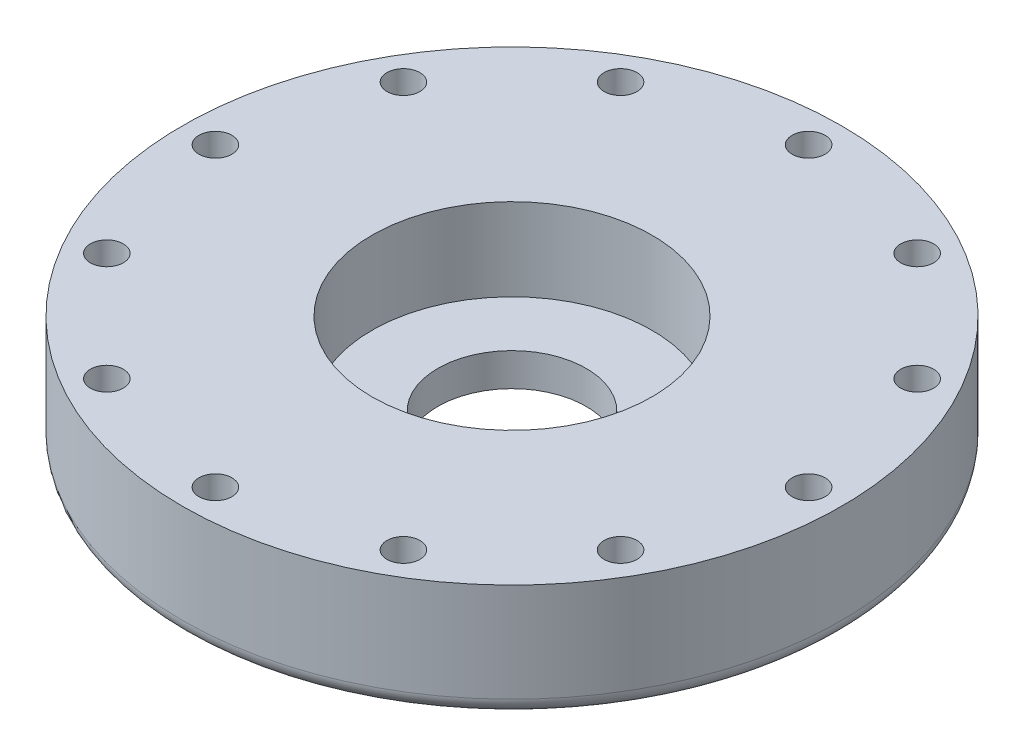
ISO-10303-21;
HEADER;
FILE_DESCRIPTION(('STEP AP214'),'2;1');
FILE_NAME('part.step','',(''),(''),'','','');
FILE_SCHEMA(('AUTOMOTIVE_DESIGN { 1 0 10303 214 1 1 1 1 }'));
ENDSEC;
DATA;
#1=APPLICATION_CONTEXT('core data for automotive mechanical design processes');
#2=APPLICATION_PROTOCOL_DEFINITION('international standard','automotive_design',2000,#1);
#3=PRODUCT_CONTEXT('',#1,'mechanical');
#4=PRODUCT('Part','Part','',(#3));
#5=PRODUCT_RELATED_PRODUCT_CATEGORY('part','',(#4));
#6=PRODUCT_DEFINITION_FORMATION('','',#4);
#7=PRODUCT_DEFINITION_CONTEXT('part definition',#1,'design');
#8=PRODUCT_DEFINITION('design','',#6,#7);
#9=PRODUCT_DEFINITION_SHAPE('','',#8);
#10=(LENGTH_UNIT() NAMED_UNIT(*) SI_UNIT(.MILLI.,.METRE.));
#11=(NAMED_UNIT(*) PLANE_ANGLE_UNIT() SI_UNIT($,.RADIAN.));
#12=(NAMED_UNIT(*) SI_UNIT($,.STERADIAN.) SOLID_ANGLE_UNIT());
#13=UNCERTAINTY_MEASURE_WITH_UNIT(LENGTH_MEASURE(1.E-05),#10,'distance_accuracy_value','');
#14=(GEOMETRIC_REPRESENTATION_CONTEXT(3) GLOBAL_UNCERTAINTY_ASSIGNED_CONTEXT((#13)) GLOBAL_UNIT_ASSIGNED_CONTEXT((#10,
#11,#12)) REPRESENTATION_CONTEXT('',''));
#15=CARTESIAN_POINT('',(0.,0.,0.));
#16=DIRECTION('',(0.,0.,1.));
#17=DIRECTION('',(1.,0.,0.));
#18=AXIS2_PLACEMENT_3D('',#15,#16,#17);
#19=CARTESIAN_POINT('',(0.,7.,0.));
#20=DIRECTION('',(0.,-1.,0.));
#21=DIRECTION('',(0.,0.,-1.));
#22=AXIS2_PLACEMENT_3D('',#19,#20,#21);
#23=CYLINDRICAL_SURFACE('',#22,20.);
#24=CARTESIAN_POINT('',(0.,1.,0.));
#25=DIRECTION('',(0.,1.,0.));
#26=DIRECTION('',(0.,0.,1.));
#27=AXIS2_PLACEMENT_3D('',#24,#25,#26);
#28=CIRCLE('',#27,20.);
#29=CARTESIAN_POINT('',(0.,1.,20.));
#30=VERTEX_POINT('',#29);
#31=EDGE_CURVE('E39',#30,#30,#28,.T.);
#32=ORIENTED_EDGE('',*,*,#31,.T.);
#33=EDGE_LOOP('',(#32));
#34=FACE_BOUND('',#33,.T.);
#35=CARTESIAN_POINT('',(0.,7.,0.));
#36=DIRECTION('',(0.,1.,0.));
#37=DIRECTION('',(0.,0.,1.));
#38=AXIS2_PLACEMENT_3D('',#35,#36,#37);
#39=CIRCLE('',#38,20.);
#40=CARTESIAN_POINT('',(0.,7.,20.));
#41=VERTEX_POINT('',#40);
#42=EDGE_CURVE('E43',#41,#41,#39,.T.);
#43=ORIENTED_EDGE('',*,*,#42,.F.);
#44=EDGE_LOOP('',(#43));
#45=FACE_BOUND('',#44,.T.);
#46=ADVANCED_FACE('F32',(#34,#45),#23,.T.);
#47=CARTESIAN_POINT('',(0.,7.,0.));
#48=DIRECTION('',(0.,1.,0.));
#49=DIRECTION('',(0.,0.,1.));
#50=AXIS2_PLACEMENT_3D('',#47,#48,#49);
#51=PLANE('',#50);
#52=CARTESIAN_POINT('',(0.,7.,-18.));
#53=DIRECTION('',(0.,1.,0.));
#54=DIRECTION('',(0.,0.,1.));
#55=AXIS2_PLACEMENT_3D('',#52,#53,#54);
#56=CIRCLE('',#55,1.);
#57=CARTESIAN_POINT('',(0.,7.,-17.));
#58=VERTEX_POINT('',#57);
#59=EDGE_CURVE('E87',#58,#58,#56,.T.);
#60=ORIENTED_EDGE('',*,*,#59,.F.);
#61=EDGE_LOOP('',(#60));
#62=FACE_BOUND('',#61,.T.);
#63=CARTESIAN_POINT('',(-9.00000000000001,7.,-15.5884572681199));
#64=DIRECTION('',(0.,1.,0.));
#65=DIRECTION('',(0.,0.,1.));
#66=AXIS2_PLACEMENT_3D('',#63,#64,#65);
#67=CIRCLE('',#66,1.);
#68=CARTESIAN_POINT('',(-9.00000000000001,7.,-14.5884572681199));
#69=VERTEX_POINT('',#68);
#70=EDGE_CURVE('E112',#69,#69,#67,.T.);
#71=ORIENTED_EDGE('',*,*,#70,.F.);
#72=EDGE_LOOP('',(#71));
#73=FACE_BOUND('',#72,.T.);
#74=CARTESIAN_POINT('',(-15.5884572681199,7.,-8.99999999999999));
#75=DIRECTION('',(0.,1.,0.));
#76=DIRECTION('',(0.,0.,1.));
#77=AXIS2_PLACEMENT_3D('',#74,#75,#76);
#78=CIRCLE('',#77,1.);
#79=CARTESIAN_POINT('',(-15.5884572681199,7.,-7.99999999999999));
#80=VERTEX_POINT('',#79);
#81=EDGE_CURVE('E118',#80,#80,#78,.T.);
#82=ORIENTED_EDGE('',*,*,#81,.F.);
#83=EDGE_LOOP('',(#82));
#84=FACE_BOUND('',#83,.T.);
#85=CARTESIAN_POINT('',(-18.,7.,0.));
#86=DIRECTION('',(0.,1.,0.));
#87=DIRECTION('',(0.,0.,1.));
#88=AXIS2_PLACEMENT_3D('',#85,#86,#87);
#89=CIRCLE('',#88,1.);
#90=CARTESIAN_POINT('',(-18.,7.,1.00000000000001));
#91=VERTEX_POINT('',#90);
#92=EDGE_CURVE('E124',#91,#91,#89,.T.);
#93=ORIENTED_EDGE('',*,*,#92,.F.);
#94=EDGE_LOOP('',(#93));
#95=FACE_BOUND('',#94,.T.);
#96=CARTESIAN_POINT('',(9.,7.,-15.5884572681199));
#97=DIRECTION('',(0.,1.,0.));
#98=DIRECTION('',(0.,0.,1.));
#99=AXIS2_PLACEMENT_3D('',#96,#97,#98);
#100=CIRCLE('',#99,1.);
#101=CARTESIAN_POINT('',(9.,7.,-14.5884572681199));
#102=VERTEX_POINT('',#101);
#103=EDGE_CURVE('E81',#102,#102,#100,.T.);
#104=ORIENTED_EDGE('',*,*,#103,.F.);
#105=EDGE_LOOP('',(#104));
#106=FACE_BOUND('',#105,.T.);
#107=CARTESIAN_POINT('',(15.5884572681199,7.,-9.));
#108=DIRECTION('',(0.,1.,0.));
#109=DIRECTION('',(0.,0.,1.));
#110=AXIS2_PLACEMENT_3D('',#107,#108,#109);
#111=CIRCLE('',#110,1.);
#112=CARTESIAN_POINT('',(15.5884572681199,7.,-8.));
#113=VERTEX_POINT('',#112);
#114=EDGE_CURVE('E75',#113,#113,#111,.T.);
#115=ORIENTED_EDGE('',*,*,#114,.F.);
#116=EDGE_LOOP('',(#115));
#117=FACE_BOUND('',#116,.T.);
#118=CARTESIAN_POINT('',(18.,7.,0.));
#119=DIRECTION('',(0.,1.,0.));
#120=DIRECTION('',(0.,0.,1.));
#121=AXIS2_PLACEMENT_3D('',#118,#119,#120);
#122=CIRCLE('',#121,1.);
#123=CARTESIAN_POINT('',(18.,7.,1.));
#124=VERTEX_POINT('',#123);
#125=EDGE_CURVE('E69',#124,#124,#122,.T.);
#126=ORIENTED_EDGE('',*,*,#125,.F.);
#127=EDGE_LOOP('',(#126));
#128=FACE_BOUND('',#127,.T.);
#129=CARTESIAN_POINT('',(15.5884572681199,7.,9.));
#130=DIRECTION('',(0.,1.,0.));
#131=DIRECTION('',(0.,0.,1.));
#132=AXIS2_PLACEMENT_3D('',#129,#130,#131);
#133=CIRCLE('',#132,1.);
#134=CARTESIAN_POINT('',(15.5884572681199,7.,10.));
#135=VERTEX_POINT('',#134);
#136=EDGE_CURVE('E62',#135,#135,#133,.T.);
#137=ORIENTED_EDGE('',*,*,#136,.F.);
#138=EDGE_LOOP('',(#137));
#139=FACE_BOUND('',#138,.T.);
#140=CARTESIAN_POINT('',(9.00000000000001,7.,15.5884572681199));
#141=DIRECTION('',(0.,1.,0.));
#142=DIRECTION('',(0.,0.,1.));
#143=AXIS2_PLACEMENT_3D('',#140,#141,#142);
#144=CIRCLE('',#143,1.);
#145=CARTESIAN_POINT('',(9.00000000000001,7.,16.5884572681199));
#146=VERTEX_POINT('',#145);
#147=EDGE_CURVE('E107',#146,#146,#144,.T.);
#148=ORIENTED_EDGE('',*,*,#147,.F.);
#149=EDGE_LOOP('',(#148));
#150=FACE_BOUND('',#149,.T.);
#151=CARTESIAN_POINT('',(0.,7.,18.));
#152=DIRECTION('',(0.,1.,0.));
#153=DIRECTION('',(0.,0.,1.));
#154=AXIS2_PLACEMENT_3D('',#151,#152,#153);
#155=CIRCLE('',#154,1.);
#156=CARTESIAN_POINT('',(0.,7.,19.));
#157=VERTEX_POINT('',#156);
#158=EDGE_CURVE('E101',#157,#157,#155,.T.);
#159=ORIENTED_EDGE('',*,*,#158,.F.);
#160=EDGE_LOOP('',(#159));
#161=FACE_BOUND('',#160,.T.);
#162=CARTESIAN_POINT('',(-8.99999999999999,7.,15.5884572681199));
#163=DIRECTION('',(0.,1.,0.));
#164=DIRECTION('',(0.,0.,1.));
#165=AXIS2_PLACEMENT_3D('',#162,#163,#164);
#166=CIRCLE('',#165,1.);
#167=CARTESIAN_POINT('',(-8.99999999999999,7.,16.5884572681199));
#168=VERTEX_POINT('',#167);
#169=EDGE_CURVE('E95',#168,#168,#166,.T.);
#170=ORIENTED_EDGE('',*,*,#169,.F.);
#171=EDGE_LOOP('',(#170));
#172=FACE_BOUND('',#171,.T.);
#173=CARTESIAN_POINT('',(-15.5884572681199,7.,9.00000000000001));
#174=DIRECTION('',(0.,1.,0.));
#175=DIRECTION('',(0.,0.,1.));
#176=AXIS2_PLACEMENT_3D('',#173,#174,#175);
#177=CIRCLE('',#176,1.);
#178=CARTESIAN_POINT('',(-15.5884572681199,7.,10.));
#179=VERTEX_POINT('',#178);
#180=EDGE_CURVE('E88',#179,#179,#177,.T.);
#181=ORIENTED_EDGE('',*,*,#180,.F.);
#182=EDGE_LOOP('',(#181));
#183=FACE_BOUND('',#182,.T.);
#184=CARTESIAN_POINT('',(0.,7.,0.));
#185=DIRECTION('',(0.,1.,0.));
#186=DIRECTION('',(0.,0.,1.));
#187=AXIS2_PLACEMENT_3D('',#184,#185,#186);
#188=CIRCLE('',#187,8.5);
#189=CARTESIAN_POINT('',(0.,7.,8.5));
#190=VERTEX_POINT('',#189);
#191=EDGE_CURVE('E50',#190,#190,#188,.T.);
#192=ORIENTED_EDGE('',*,*,#191,.F.);
#193=EDGE_LOOP('',(#192));
#194=FACE_BOUND('',#193,.T.);
#195=ORIENTED_EDGE('',*,*,#42,.T.);
#196=EDGE_LOOP('',(#195));
#197=FACE_BOUND('',#196,.T.);
#198=ADVANCED_FACE('F143',(#62,#73,#84,#95,#106,#117,#128,#139,#150,#161,#172,#183,#194,#197),
#51,.T.);
#199=CARTESIAN_POINT('',(0.,0.,0.));
#200=DIRECTION('',(0.,1.,0.));
#201=DIRECTION('',(0.,0.,1.));
#202=AXIS2_PLACEMENT_3D('',#199,#200,#201);
#203=PLANE('',#202);
#204=CARTESIAN_POINT('',(0.,0.,0.));
#205=DIRECTION('',(0.,1.,0.));
#206=DIRECTION('',(0.,0.,1.));
#207=AXIS2_PLACEMENT_3D('',#204,#205,#206);
#208=CIRCLE('',#207,19.);
#209=CARTESIAN_POINT('',(0.,0.,19.));
#210=VERTEX_POINT('',#209);
#211=EDGE_CURVE('E10',#210,#210,#208,.F.);
#212=ORIENTED_EDGE('',*,*,#211,.T.);
#213=EDGE_LOOP('',(#212));
#214=FACE_BOUND('',#213,.T.);
#215=CARTESIAN_POINT('',(0.,0.,0.));
#216=DIRECTION('',(0.,1.,0.));
#217=DIRECTION('',(0.,0.,1.));
#218=AXIS2_PLACEMENT_3D('',#215,#216,#217);
#219=CIRCLE('',#218,4.5);
#220=CARTESIAN_POINT('',(0.,0.,4.5));
#221=VERTEX_POINT('',#220);
#222=EDGE_CURVE('E53',#221,#221,#219,.T.);
#223=ORIENTED_EDGE('',*,*,#222,.T.);
#224=EDGE_LOOP('',(#223));
#225=FACE_BOUND('',#224,.T.);
#226=ADVANCED_FACE('F146',(#214,#225),#203,.F.);
#227=CARTESIAN_POINT('',(0.,2.,0.));
#228=DIRECTION('',(0.,1.,0.));
#229=DIRECTION('',(0.,0.,1.));
#230=AXIS2_PLACEMENT_3D('',#227,#228,#229);
#231=CYLINDRICAL_SURFACE('',#230,8.5);
#232=CARTESIAN_POINT('',(0.,2.,0.));
#233=DIRECTION('',(0.,1.,0.));
#234=DIRECTION('',(0.,0.,1.));
#235=AXIS2_PLACEMENT_3D('',#232,#233,#234);
#236=CIRCLE('',#235,8.5);
#237=CARTESIAN_POINT('',(0.,2.,8.5));
#238=VERTEX_POINT('',#237);
#239=EDGE_CURVE('E47',#238,#238,#236,.T.);
#240=ORIENTED_EDGE('',*,*,#239,.F.);
#241=EDGE_LOOP('',(#240));
#242=FACE_BOUND('',#241,.T.);
#243=ORIENTED_EDGE('',*,*,#191,.T.);
#244=EDGE_LOOP('',(#243));
#245=FACE_BOUND('',#244,.T.);
#246=ADVANCED_FACE('F179',(#242,#245),#231,.F.);
#247=CARTESIAN_POINT('',(0.,2.,0.));
#248=DIRECTION('',(0.,1.,0.));
#249=DIRECTION('',(0.,0.,1.));
#250=AXIS2_PLACEMENT_3D('',#247,#248,#249);
#251=PLANE('',#250);
#252=CARTESIAN_POINT('',(0.,2.,0.));
#253=DIRECTION('',(0.,1.,0.));
#254=DIRECTION('',(0.,0.,1.));
#255=AXIS2_PLACEMENT_3D('',#252,#253,#254);
#256=CIRCLE('',#255,4.5);
#257=CARTESIAN_POINT('',(0.,2.,4.5));
#258=VERTEX_POINT('',#257);
#259=EDGE_CURVE('E56',#258,#258,#256,.T.);
#260=ORIENTED_EDGE('',*,*,#259,.F.);
#261=EDGE_LOOP('',(#260));
#262=FACE_BOUND('',#261,.T.);
#263=ORIENTED_EDGE('',*,*,#239,.T.);
#264=EDGE_LOOP('',(#263));
#265=FACE_BOUND('',#264,.T.);
#266=ADVANCED_FACE('F183',(#262,#265),#251,.T.);
#267=CARTESIAN_POINT('',(0.,0.,0.));
#268=DIRECTION('',(0.,1.,0.));
#269=DIRECTION('',(0.,0.,1.));
#270=AXIS2_PLACEMENT_3D('',#267,#268,#269);
#271=CYLINDRICAL_SURFACE('',#270,4.5);
#272=ORIENTED_EDGE('',*,*,#222,.F.);
#273=EDGE_LOOP('',(#272));
#274=FACE_BOUND('',#273,.T.);
#275=ORIENTED_EDGE('',*,*,#259,.T.);
#276=EDGE_LOOP('',(#275));
#277=FACE_BOUND('',#276,.T.);
#278=ADVANCED_FACE('F187',(#274,#277),#271,.F.);
#279=CARTESIAN_POINT('',(-15.5884572681199,2.,9.00000000000001));
#280=DIRECTION('',(0.,1.,0.));
#281=DIRECTION('',(0.,0.,1.));
#282=AXIS2_PLACEMENT_3D('',#279,#280,#281);
#283=CYLINDRICAL_SURFACE('',#282,1.);
#284=CARTESIAN_POINT('',(-15.5884572681199,2.,9.00000000000001));
#285=DIRECTION('',(0.,1.,0.));
#286=DIRECTION('',(0.,0.,1.));
#287=AXIS2_PLACEMENT_3D('',#284,#285,#286);
#288=CIRCLE('',#287,1.);
#289=CARTESIAN_POINT('',(-15.5884572681199,2.,10.));
#290=VERTEX_POINT('',#289);
#291=EDGE_CURVE('E91',#290,#290,#288,.T.);
#292=ORIENTED_EDGE('',*,*,#291,.F.);
#293=EDGE_LOOP('',(#292));
#294=FACE_BOUND('',#293,.T.);
#295=ORIENTED_EDGE('',*,*,#180,.T.);
#296=EDGE_LOOP('',(#295));
#297=FACE_BOUND('',#296,.T.);
#298=ADVANCED_FACE('F191',(#294,#297),#283,.F.);
#299=CARTESIAN_POINT('',(-15.5884572681199,2.,9.00000000000001));
#300=DIRECTION('',(0.,1.,0.));
#301=DIRECTION('',(0.,0.,1.));
#302=AXIS2_PLACEMENT_3D('',#299,#300,#301);
#303=PLANE('',#302);
#304=ORIENTED_EDGE('',*,*,#291,.T.);
#305=EDGE_LOOP('',(#304));
#306=FACE_BOUND('',#305,.T.);
#307=ADVANCED_FACE('F229',(#306),#303,.T.);
#308=CARTESIAN_POINT('',(-8.99999999999999,2.,15.5884572681199));
#309=DIRECTION('',(0.,1.,0.));
#310=DIRECTION('',(0.,0.,1.));
#311=AXIS2_PLACEMENT_3D('',#308,#309,#310);
#312=CYLINDRICAL_SURFACE('',#311,1.);
#313=CARTESIAN_POINT('',(-8.99999999999999,2.,15.5884572681199));
#314=DIRECTION('',(0.,1.,0.));
#315=DIRECTION('',(0.,0.,1.));
#316=AXIS2_PLACEMENT_3D('',#313,#314,#315);
#317=CIRCLE('',#316,1.);
#318=CARTESIAN_POINT('',(-8.99999999999999,2.,16.5884572681199));
#319=VERTEX_POINT('',#318);
#320=EDGE_CURVE('E98',#319,#319,#317,.T.);
#321=ORIENTED_EDGE('',*,*,#320,.F.);
#322=EDGE_LOOP('',(#321));
#323=FACE_BOUND('',#322,.T.);
#324=ORIENTED_EDGE('',*,*,#169,.T.);
#325=EDGE_LOOP('',(#324));
#326=FACE_BOUND('',#325,.T.);
#327=ADVANCED_FACE('F233',(#323,#326),#312,.F.);
#328=CARTESIAN_POINT('',(-8.99999999999999,2.,15.5884572681199));
#329=DIRECTION('',(0.,1.,0.));
#330=DIRECTION('',(0.,0.,1.));
#331=AXIS2_PLACEMENT_3D('',#328,#329,#330);
#332=PLANE('',#331);
#333=ORIENTED_EDGE('',*,*,#320,.T.);
#334=EDGE_LOOP('',(#333));
#335=FACE_BOUND('',#334,.T.);
#336=ADVANCED_FACE('F237',(#335),#332,.T.);
#337=CARTESIAN_POINT('',(0.,2.,18.));
#338=DIRECTION('',(0.,1.,0.));
#339=DIRECTION('',(0.,0.,1.));
#340=AXIS2_PLACEMENT_3D('',#337,#338,#339);
#341=CYLINDRICAL_SURFACE('',#340,1.);
#342=CARTESIAN_POINT('',(0.,2.,18.));
#343=DIRECTION('',(0.,1.,0.));
#344=DIRECTION('',(0.,0.,1.));
#345=AXIS2_PLACEMENT_3D('',#342,#343,#344);
#346=CIRCLE('',#345,1.);
#347=CARTESIAN_POINT('',(0.,2.,19.));
#348=VERTEX_POINT('',#347);
#349=EDGE_CURVE('E104',#348,#348,#346,.T.);
#350=ORIENTED_EDGE('',*,*,#349,.F.);
#351=EDGE_LOOP('',(#350));
#352=FACE_BOUND('',#351,.T.);
#353=ORIENTED_EDGE('',*,*,#158,.T.);
#354=EDGE_LOOP('',(#353));
#355=FACE_BOUND('',#354,.T.);
#356=ADVANCED_FACE('F241',(#352,#355),#341,.F.);
#357=CARTESIAN_POINT('',(0.,2.,18.));
#358=DIRECTION('',(0.,1.,0.));
#359=DIRECTION('',(0.,0.,1.));
#360=AXIS2_PLACEMENT_3D('',#357,#358,#359);
#361=PLANE('',#360);
#362=ORIENTED_EDGE('',*,*,#349,.T.);
#363=EDGE_LOOP('',(#362));
#364=FACE_BOUND('',#363,.T.);
#365=ADVANCED_FACE('F245',(#364),#361,.T.);
#366=CARTESIAN_POINT('',(9.00000000000001,2.,15.5884572681199));
#367=DIRECTION('',(0.,1.,0.));
#368=DIRECTION('',(0.,0.,1.));
#369=AXIS2_PLACEMENT_3D('',#366,#367,#368);
#370=CYLINDRICAL_SURFACE('',#369,1.);
#371=CARTESIAN_POINT('',(9.00000000000001,2.,15.5884572681199));
#372=DIRECTION('',(0.,1.,0.));
#373=DIRECTION('',(0.,0.,1.));
#374=AXIS2_PLACEMENT_3D('',#371,#372,#373);
#375=CIRCLE('',#374,1.);
#376=CARTESIAN_POINT('',(9.00000000000001,2.,16.5884572681199));
#377=VERTEX_POINT('',#376);
#378=EDGE_CURVE('E66',#377,#377,#375,.T.);
#379=ORIENTED_EDGE('',*,*,#378,.F.);
#380=EDGE_LOOP('',(#379));
#381=FACE_BOUND('',#380,.T.);
#382=ORIENTED_EDGE('',*,*,#147,.T.);
#383=EDGE_LOOP('',(#382));
#384=FACE_BOUND('',#383,.T.);
#385=ADVANCED_FACE('F249',(#381,#384),#370,.F.);
#386=CARTESIAN_POINT('',(9.00000000000001,2.,15.5884572681199));
#387=DIRECTION('',(0.,1.,0.));
#388=DIRECTION('',(0.,0.,1.));
#389=AXIS2_PLACEMENT_3D('',#386,#387,#388);
#390=PLANE('',#389);
#391=ORIENTED_EDGE('',*,*,#378,.T.);
#392=EDGE_LOOP('',(#391));
#393=FACE_BOUND('',#392,.T.);
#394=ADVANCED_FACE('F197',(#393),#390,.T.);
#395=CARTESIAN_POINT('',(15.5884572681199,2.,9.));
#396=DIRECTION('',(0.,1.,0.));
#397=DIRECTION('',(0.,0.,1.));
#398=AXIS2_PLACEMENT_3D('',#395,#396,#397);
#399=CYLINDRICAL_SURFACE('',#398,1.);
#400=CARTESIAN_POINT('',(15.5884572681199,2.,9.));
#401=DIRECTION('',(0.,1.,0.));
#402=DIRECTION('',(0.,0.,1.));
#403=AXIS2_PLACEMENT_3D('',#400,#401,#402);
#404=CIRCLE('',#403,1.);
#405=CARTESIAN_POINT('',(15.5884572681199,2.,10.));
#406=VERTEX_POINT('',#405);
#407=EDGE_CURVE('E65',#406,#406,#404,.T.);
#408=ORIENTED_EDGE('',*,*,#407,.F.);
#409=EDGE_LOOP('',(#408));
#410=FACE_BOUND('',#409,.T.);
#411=ORIENTED_EDGE('',*,*,#136,.T.);
#412=EDGE_LOOP('',(#411));
#413=FACE_BOUND('',#412,.T.);
#414=ADVANCED_FACE('F193',(#410,#413),#399,.F.);
#415=CARTESIAN_POINT('',(15.5884572681199,2.,9.));
#416=DIRECTION('',(0.,1.,0.));
#417=DIRECTION('',(0.,0.,1.));
#418=AXIS2_PLACEMENT_3D('',#415,#416,#417);
#419=PLANE('',#418);
#420=ORIENTED_EDGE('',*,*,#407,.T.);
#421=EDGE_LOOP('',(#420));
#422=FACE_BOUND('',#421,.T.);
#423=ADVANCED_FACE('F196',(#422),#419,.T.);
#424=CARTESIAN_POINT('',(18.,2.,0.));
#425=DIRECTION('',(0.,1.,0.));
#426=DIRECTION('',(0.,0.,1.));
#427=AXIS2_PLACEMENT_3D('',#424,#425,#426);
#428=CYLINDRICAL_SURFACE('',#427,1.);
#429=CARTESIAN_POINT('',(18.,2.,0.));
#430=DIRECTION('',(0.,1.,0.));
#431=DIRECTION('',(0.,0.,1.));
#432=AXIS2_PLACEMENT_3D('',#429,#430,#431);
#433=CIRCLE('',#432,1.);
#434=CARTESIAN_POINT('',(18.,2.,1.));
#435=VERTEX_POINT('',#434);
#436=EDGE_CURVE('E72',#435,#435,#433,.T.);
#437=ORIENTED_EDGE('',*,*,#436,.F.);
#438=EDGE_LOOP('',(#437));
#439=FACE_BOUND('',#438,.T.);
#440=ORIENTED_EDGE('',*,*,#125,.T.);
#441=EDGE_LOOP('',(#440));
#442=FACE_BOUND('',#441,.T.);
#443=ADVANCED_FACE('F201',(#439,#442),#428,.F.);
#444=CARTESIAN_POINT('',(18.,2.,0.));
#445=DIRECTION('',(0.,1.,0.));
#446=DIRECTION('',(0.,0.,1.));
#447=AXIS2_PLACEMENT_3D('',#444,#445,#446);
#448=PLANE('',#447);
#449=ORIENTED_EDGE('',*,*,#436,.T.);
#450=EDGE_LOOP('',(#449));
#451=FACE_BOUND('',#450,.T.);
#452=ADVANCED_FACE('F205',(#451),#448,.T.);
#453=CARTESIAN_POINT('',(15.5884572681199,2.,-9.));
#454=DIRECTION('',(0.,1.,0.));
#455=DIRECTION('',(0.,0.,1.));
#456=AXIS2_PLACEMENT_3D('',#453,#454,#455);
#457=CYLINDRICAL_SURFACE('',#456,1.);
#458=CARTESIAN_POINT('',(15.5884572681199,2.,-9.));
#459=DIRECTION('',(0.,1.,0.));
#460=DIRECTION('',(0.,0.,1.));
#461=AXIS2_PLACEMENT_3D('',#458,#459,#460);
#462=CIRCLE('',#461,1.);
#463=CARTESIAN_POINT('',(15.5884572681199,2.,-8.));
#464=VERTEX_POINT('',#463);
#465=EDGE_CURVE('E78',#464,#464,#462,.T.);
#466=ORIENTED_EDGE('',*,*,#465,.F.);
#467=EDGE_LOOP('',(#466));
#468=FACE_BOUND('',#467,.T.);
#469=ORIENTED_EDGE('',*,*,#114,.T.);
#470=EDGE_LOOP('',(#469));
#471=FACE_BOUND('',#470,.T.);
#472=ADVANCED_FACE('F209',(#468,#471),#457,.F.);
#473=CARTESIAN_POINT('',(15.5884572681199,2.,-9.));
#474=DIRECTION('',(0.,1.,0.));
#475=DIRECTION('',(0.,0.,1.));
#476=AXIS2_PLACEMENT_3D('',#473,#474,#475);
#477=PLANE('',#476);
#478=ORIENTED_EDGE('',*,*,#465,.T.);
#479=EDGE_LOOP('',(#478));
#480=FACE_BOUND('',#479,.T.);
#481=ADVANCED_FACE('F213',(#480),#477,.T.);
#482=CARTESIAN_POINT('',(9.,2.,-15.5884572681199));
#483=DIRECTION('',(0.,1.,0.));
#484=DIRECTION('',(0.,0.,1.));
#485=AXIS2_PLACEMENT_3D('',#482,#483,#484);
#486=CYLINDRICAL_SURFACE('',#485,1.);
#487=CARTESIAN_POINT('',(9.,2.,-15.5884572681199));
#488=DIRECTION('',(0.,1.,0.));
#489=DIRECTION('',(0.,0.,1.));
#490=AXIS2_PLACEMENT_3D('',#487,#488,#489);
#491=CIRCLE('',#490,1.);
#492=CARTESIAN_POINT('',(9.,2.,-14.5884572681199));
#493=VERTEX_POINT('',#492);
#494=EDGE_CURVE('E84',#493,#493,#491,.T.);
#495=ORIENTED_EDGE('',*,*,#494,.F.);
#496=EDGE_LOOP('',(#495));
#497=FACE_BOUND('',#496,.T.);
#498=ORIENTED_EDGE('',*,*,#103,.T.);
#499=EDGE_LOOP('',(#498));
#500=FACE_BOUND('',#499,.T.);
#501=ADVANCED_FACE('F217',(#497,#500),#486,.F.);
#502=CARTESIAN_POINT('',(9.,2.,-15.5884572681199));
#503=DIRECTION('',(0.,1.,0.));
#504=DIRECTION('',(0.,0.,1.));
#505=AXIS2_PLACEMENT_3D('',#502,#503,#504);
#506=PLANE('',#505);
#507=ORIENTED_EDGE('',*,*,#494,.T.);
#508=EDGE_LOOP('',(#507));
#509=FACE_BOUND('',#508,.T.);
#510=ADVANCED_FACE('F221',(#509),#506,.T.);
#511=CARTESIAN_POINT('',(-18.,2.,0.));
#512=DIRECTION('',(0.,1.,0.));
#513=DIRECTION('',(0.,0.,1.));
#514=AXIS2_PLACEMENT_3D('',#511,#512,#513);
#515=CYLINDRICAL_SURFACE('',#514,1.);
#516=CARTESIAN_POINT('',(-18.,2.,0.));
#517=DIRECTION('',(0.,1.,0.));
#518=DIRECTION('',(0.,0.,1.));
#519=AXIS2_PLACEMENT_3D('',#516,#517,#518);
#520=CIRCLE('',#519,1.);
#521=CARTESIAN_POINT('',(-18.,2.,1.00000000000001));
#522=VERTEX_POINT('',#521);
#523=EDGE_CURVE('E92',#522,#522,#520,.T.);
#524=ORIENTED_EDGE('',*,*,#523,.F.);
#525=EDGE_LOOP('',(#524));
#526=FACE_BOUND('',#525,.T.);
#527=ORIENTED_EDGE('',*,*,#92,.T.);
#528=EDGE_LOOP('',(#527));
#529=FACE_BOUND('',#528,.T.);
#530=ADVANCED_FACE('F225',(#526,#529),#515,.F.);
#531=CARTESIAN_POINT('',(-18.,2.,0.));
#532=DIRECTION('',(0.,1.,0.));
#533=DIRECTION('',(0.,0.,1.));
#534=AXIS2_PLACEMENT_3D('',#531,#532,#533);
#535=PLANE('',#534);
#536=ORIENTED_EDGE('',*,*,#523,.T.);
#537=EDGE_LOOP('',(#536));
#538=FACE_BOUND('',#537,.T.);
#539=ADVANCED_FACE('F268',(#538),#535,.T.);
#540=CARTESIAN_POINT('',(-15.5884572681199,2.,-8.99999999999999));
#541=DIRECTION('',(0.,1.,0.));
#542=DIRECTION('',(0.,0.,1.));
#543=AXIS2_PLACEMENT_3D('',#540,#541,#542);
#544=CYLINDRICAL_SURFACE('',#543,1.);
#545=CARTESIAN_POINT('',(-15.5884572681199,2.,-8.99999999999999));
#546=DIRECTION('',(0.,1.,0.));
#547=DIRECTION('',(0.,0.,1.));
#548=AXIS2_PLACEMENT_3D('',#545,#546,#547);
#549=CIRCLE('',#548,1.);
#550=CARTESIAN_POINT('',(-15.5884572681199,2.,-7.99999999999999));
#551=VERTEX_POINT('',#550);
#552=EDGE_CURVE('E121',#551,#551,#549,.T.);
#553=ORIENTED_EDGE('',*,*,#552,.F.);
#554=EDGE_LOOP('',(#553));
#555=FACE_BOUND('',#554,.T.);
#556=ORIENTED_EDGE('',*,*,#81,.T.);
#557=EDGE_LOOP('',(#556));
#558=FACE_BOUND('',#557,.T.);
#559=ADVANCED_FACE('F265',(#555,#558),#544,.F.);
#560=CARTESIAN_POINT('',(-15.5884572681199,2.,-8.99999999999999));
#561=DIRECTION('',(0.,1.,0.));
#562=DIRECTION('',(0.,0.,1.));
#563=AXIS2_PLACEMENT_3D('',#560,#561,#562);
#564=PLANE('',#563);
#565=ORIENTED_EDGE('',*,*,#552,.T.);
#566=EDGE_LOOP('',(#565));
#567=FACE_BOUND('',#566,.T.);
#568=ADVANCED_FACE('F260',(#567),#564,.T.);
#569=CARTESIAN_POINT('',(-9.00000000000001,2.,-15.5884572681199));
#570=DIRECTION('',(0.,1.,0.));
#571=DIRECTION('',(0.,0.,1.));
#572=AXIS2_PLACEMENT_3D('',#569,#570,#571);
#573=CYLINDRICAL_SURFACE('',#572,1.);
#574=CARTESIAN_POINT('',(-9.00000000000001,2.,-15.5884572681199));
#575=DIRECTION('',(0.,1.,0.));
#576=DIRECTION('',(0.,0.,1.));
#577=AXIS2_PLACEMENT_3D('',#574,#575,#576);
#578=CIRCLE('',#577,1.);
#579=CARTESIAN_POINT('',(-9.00000000000001,2.,-14.5884572681199));
#580=VERTEX_POINT('',#579);
#581=EDGE_CURVE('E115',#580,#580,#578,.T.);
#582=ORIENTED_EDGE('',*,*,#581,.F.);
#583=EDGE_LOOP('',(#582));
#584=FACE_BOUND('',#583,.T.);
#585=ORIENTED_EDGE('',*,*,#70,.T.);
#586=EDGE_LOOP('',(#585));
#587=FACE_BOUND('',#586,.T.);
#588=ADVANCED_FACE('F257',(#584,#587),#573,.F.);
#589=CARTESIAN_POINT('',(-9.00000000000001,2.,-15.5884572681199));
#590=DIRECTION('',(0.,1.,0.));
#591=DIRECTION('',(0.,0.,1.));
#592=AXIS2_PLACEMENT_3D('',#589,#590,#591);
#593=PLANE('',#592);
#594=ORIENTED_EDGE('',*,*,#581,.T.);
#595=EDGE_LOOP('',(#594));
#596=FACE_BOUND('',#595,.T.);
#597=ADVANCED_FACE('F139',(#596),#593,.T.);
#598=CARTESIAN_POINT('',(0.,2.,-18.));
#599=DIRECTION('',(0.,1.,0.));
#600=DIRECTION('',(0.,0.,1.));
#601=AXIS2_PLACEMENT_3D('',#598,#599,#600);
#602=CYLINDRICAL_SURFACE('',#601,1.);
#603=CARTESIAN_POINT('',(0.,2.,-18.));
#604=DIRECTION('',(0.,1.,0.));
#605=DIRECTION('',(0.,0.,1.));
#606=AXIS2_PLACEMENT_3D('',#603,#604,#605);
#607=CIRCLE('',#606,1.);
#608=CARTESIAN_POINT('',(0.,2.,-17.));
#609=VERTEX_POINT('',#608);
#610=EDGE_CURVE('E59',#609,#609,#607,.T.);
#611=ORIENTED_EDGE('',*,*,#610,.F.);
#612=EDGE_LOOP('',(#611));
#613=FACE_BOUND('',#612,.T.);
#614=ORIENTED_EDGE('',*,*,#59,.T.);
#615=EDGE_LOOP('',(#614));
#616=FACE_BOUND('',#615,.T.);
#617=ADVANCED_FACE('F136',(#613,#616),#602,.F.);
#618=CARTESIAN_POINT('',(0.,2.,-18.));
#619=DIRECTION('',(0.,1.,0.));
#620=DIRECTION('',(0.,0.,1.));
#621=AXIS2_PLACEMENT_3D('',#618,#619,#620);
#622=PLANE('',#621);
#623=ORIENTED_EDGE('',*,*,#610,.T.);
#624=EDGE_LOOP('',(#623));
#625=FACE_BOUND('',#624,.T.);
#626=ADVANCED_FACE('F134',(#625),#622,.T.);
#627=CARTESIAN_POINT('',(0.,1.,0.));
#628=DIRECTION('',(0.,1.,0.));
#629=DIRECTION('',(0.,0.,1.));
#630=AXIS2_PLACEMENT_3D('',#627,#628,#629);
#631=TOROIDAL_SURFACE('',#630,19.,1.);
#632=ORIENTED_EDGE('',*,*,#211,.F.);
#633=EDGE_LOOP('',(#632));
#634=FACE_BOUND('',#633,.T.);
#635=ORIENTED_EDGE('',*,*,#31,.F.);
#636=EDGE_LOOP('',(#635));
#637=FACE_BOUND('',#636,.T.);
#638=ADVANCED_FACE('F34',(#634,#637),#631,.T.);
#639=CLOSED_SHELL('',(#46,#198,#226,#246,#266,#278,#298,#307,#327,#336,#356,#365,#385,#394,#414,
#423,#443,#452,#472,#481,#501,#510,#530,#539,#559,#568,#588,#597,#617,#626,#638));
#640=MANIFOLD_SOLID_BREP('B2',#639);
#641=ADVANCED_BREP_SHAPE_REPRESENTATION('',(#18,#640),#14);
#642=SHAPE_DEFINITION_REPRESENTATION(#9,#641);
ENDSEC;
END-ISO-10303-21;
